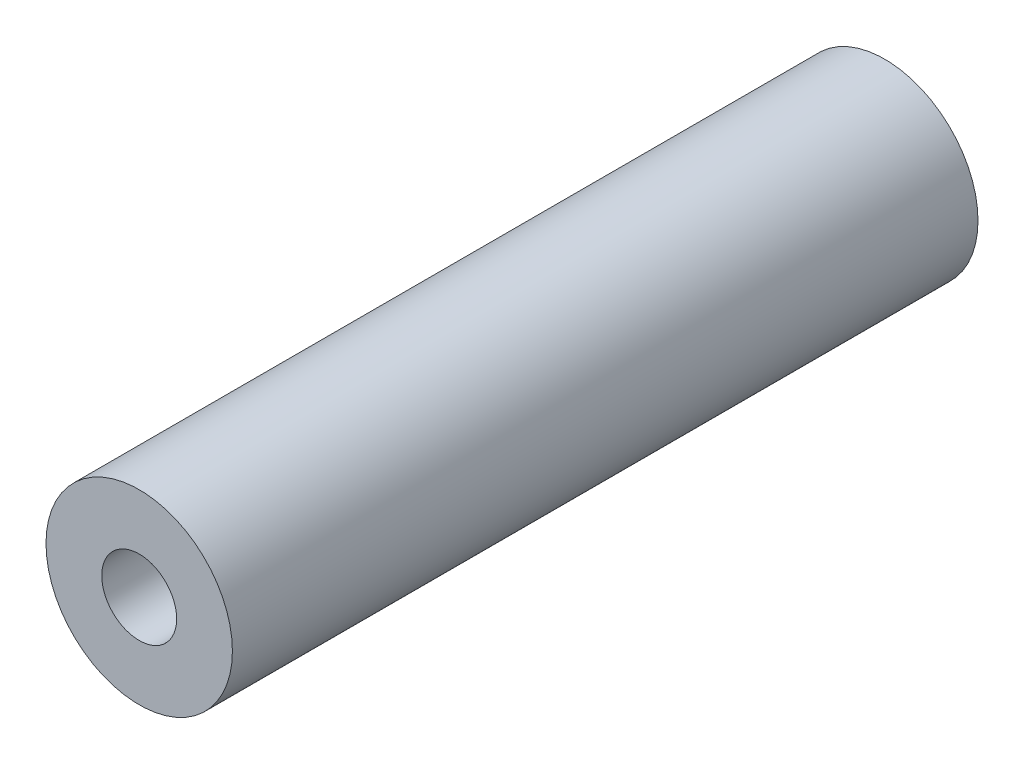
ISO-10303-21;
HEADER;
FILE_DESCRIPTION(('STEP AP214'),'2;1');
FILE_NAME('part.step','',(''),(''),'','','');
FILE_SCHEMA(('AUTOMOTIVE_DESIGN { 1 0 10303 214 1 1 1 1 }'));
ENDSEC;
DATA;
#1=APPLICATION_CONTEXT('core data for automotive mechanical design processes');
#2=APPLICATION_PROTOCOL_DEFINITION('international standard','automotive_design',2000,#1);
#3=PRODUCT_CONTEXT('',#1,'mechanical');
#4=PRODUCT('Part','Part','',(#3));
#5=PRODUCT_RELATED_PRODUCT_CATEGORY('part','',(#4));
#6=PRODUCT_DEFINITION_FORMATION('','',#4);
#7=PRODUCT_DEFINITION_CONTEXT('part definition',#1,'design');
#8=PRODUCT_DEFINITION('design','',#6,#7);
#9=PRODUCT_DEFINITION_SHAPE('','',#8);
#10=(LENGTH_UNIT() NAMED_UNIT(*) SI_UNIT(.MILLI.,.METRE.));
#11=(NAMED_UNIT(*) PLANE_ANGLE_UNIT() SI_UNIT($,.RADIAN.));
#12=(NAMED_UNIT(*) SI_UNIT($,.STERADIAN.) SOLID_ANGLE_UNIT());
#13=UNCERTAINTY_MEASURE_WITH_UNIT(LENGTH_MEASURE(1.E-05),#10,'distance_accuracy_value','');
#14=(GEOMETRIC_REPRESENTATION_CONTEXT(3) GLOBAL_UNCERTAINTY_ASSIGNED_CONTEXT((#13)) GLOBAL_UNIT_ASSIGNED_CONTEXT((#10,
#11,#12)) REPRESENTATION_CONTEXT('',''));
#15=CARTESIAN_POINT('',(0.,0.,0.));
#16=DIRECTION('',(0.,0.,1.));
#17=DIRECTION('',(1.,0.,0.));
#18=AXIS2_PLACEMENT_3D('',#15,#16,#17);
#19=CARTESIAN_POINT('',(0.,0.,25.4));
#20=DIRECTION('',(0.,0.,1.));
#21=DIRECTION('',(1.,0.,0.));
#22=AXIS2_PLACEMENT_3D('',#19,#20,#21);
#23=PLANE('',#22);
#24=CARTESIAN_POINT('',(0.,0.,25.4));
#25=DIRECTION('',(0.,0.,1.));
#26=DIRECTION('',(1.,0.,0.));
#27=AXIS2_PLACEMENT_3D('',#24,#25,#26);
#28=CIRCLE('',#27,6.35);
#29=CARTESIAN_POINT('',(6.35,0.,25.4));
#30=VERTEX_POINT('',#29);
#31=EDGE_CURVE('E10',#30,#30,#28,.T.);
#32=ORIENTED_EDGE('',*,*,#31,.T.);
#33=EDGE_LOOP('',(#32));
#34=FACE_BOUND('',#33,.T.);
#35=CARTESIAN_POINT('',(0.,0.,25.4));
#36=DIRECTION('',(0.,0.,1.));
#37=DIRECTION('',(1.,0.,0.));
#38=AXIS2_PLACEMENT_3D('',#35,#36,#37);
#39=CIRCLE('',#38,2.5527);
#40=CARTESIAN_POINT('',(2.5527,0.,25.4));
#41=VERTEX_POINT('',#40);
#42=EDGE_CURVE('E42',#41,#41,#39,.T.);
#43=ORIENTED_EDGE('',*,*,#42,.F.);
#44=EDGE_LOOP('',(#43));
#45=FACE_BOUND('',#44,.T.);
#46=ADVANCED_FACE('F31',(#34,#45),#23,.T.);
#47=CARTESIAN_POINT('',(0.,0.,-25.4));
#48=DIRECTION('',(0.,0.,1.));
#49=DIRECTION('',(1.,0.,0.));
#50=AXIS2_PLACEMENT_3D('',#47,#48,#49);
#51=PLANE('',#50);
#52=CARTESIAN_POINT('',(0.,0.,-25.4));
#53=DIRECTION('',(0.,0.,1.));
#54=DIRECTION('',(1.,0.,0.));
#55=AXIS2_PLACEMENT_3D('',#52,#53,#54);
#56=CIRCLE('',#55,6.35);
#57=CARTESIAN_POINT('',(6.35,0.,-25.4));
#58=VERTEX_POINT('',#57);
#59=EDGE_CURVE('E35',#58,#58,#56,.T.);
#60=ORIENTED_EDGE('',*,*,#59,.F.);
#61=EDGE_LOOP('',(#60));
#62=FACE_BOUND('',#61,.T.);
#63=CARTESIAN_POINT('',(0.,0.,-25.4));
#64=DIRECTION('',(0.,0.,1.));
#65=DIRECTION('',(1.,0.,0.));
#66=AXIS2_PLACEMENT_3D('',#63,#64,#65);
#67=CIRCLE('',#66,2.5527);
#68=CARTESIAN_POINT('',(2.5527,0.,-25.4));
#69=VERTEX_POINT('',#68);
#70=EDGE_CURVE('E44',#69,#69,#67,.T.);
#71=ORIENTED_EDGE('',*,*,#70,.T.);
#72=EDGE_LOOP('',(#71));
#73=FACE_BOUND('',#72,.T.);
#74=ADVANCED_FACE('F54',(#62,#73),#51,.F.);
#75=CARTESIAN_POINT('',(0.,0.,25.4));
#76=DIRECTION('',(0.,0.,-1.));
#77=DIRECTION('',(-1.,0.,0.));
#78=AXIS2_PLACEMENT_3D('',#75,#76,#77);
#79=CYLINDRICAL_SURFACE('',#78,6.35);
#80=ORIENTED_EDGE('',*,*,#31,.F.);
#81=EDGE_LOOP('',(#80));
#82=FACE_BOUND('',#81,.T.);
#83=ORIENTED_EDGE('',*,*,#59,.T.);
#84=EDGE_LOOP('',(#83));
#85=FACE_BOUND('',#84,.T.);
#86=ADVANCED_FACE('F33',(#82,#85),#79,.T.);
#87=CARTESIAN_POINT('',(0.,0.,25.4));
#88=DIRECTION('',(0.,0.,-1.));
#89=DIRECTION('',(-1.,0.,0.));
#90=AXIS2_PLACEMENT_3D('',#87,#88,#89);
#91=CYLINDRICAL_SURFACE('',#90,2.5527);
#92=ORIENTED_EDGE('',*,*,#42,.T.);
#93=EDGE_LOOP('',(#92));
#94=FACE_BOUND('',#93,.T.);
#95=ORIENTED_EDGE('',*,*,#70,.F.);
#96=EDGE_LOOP('',(#95));
#97=FACE_BOUND('',#96,.T.);
#98=ADVANCED_FACE('F50',(#94,#97),#91,.F.);
#99=CLOSED_SHELL('',(#46,#74,#86,#98));
#100=MANIFOLD_SOLID_BREP('B2',#99);
#101=ADVANCED_BREP_SHAPE_REPRESENTATION('',(#18,#100),#14);
#102=SHAPE_DEFINITION_REPRESENTATION(#9,#101);
ENDSEC;
END-ISO-10303-21;
